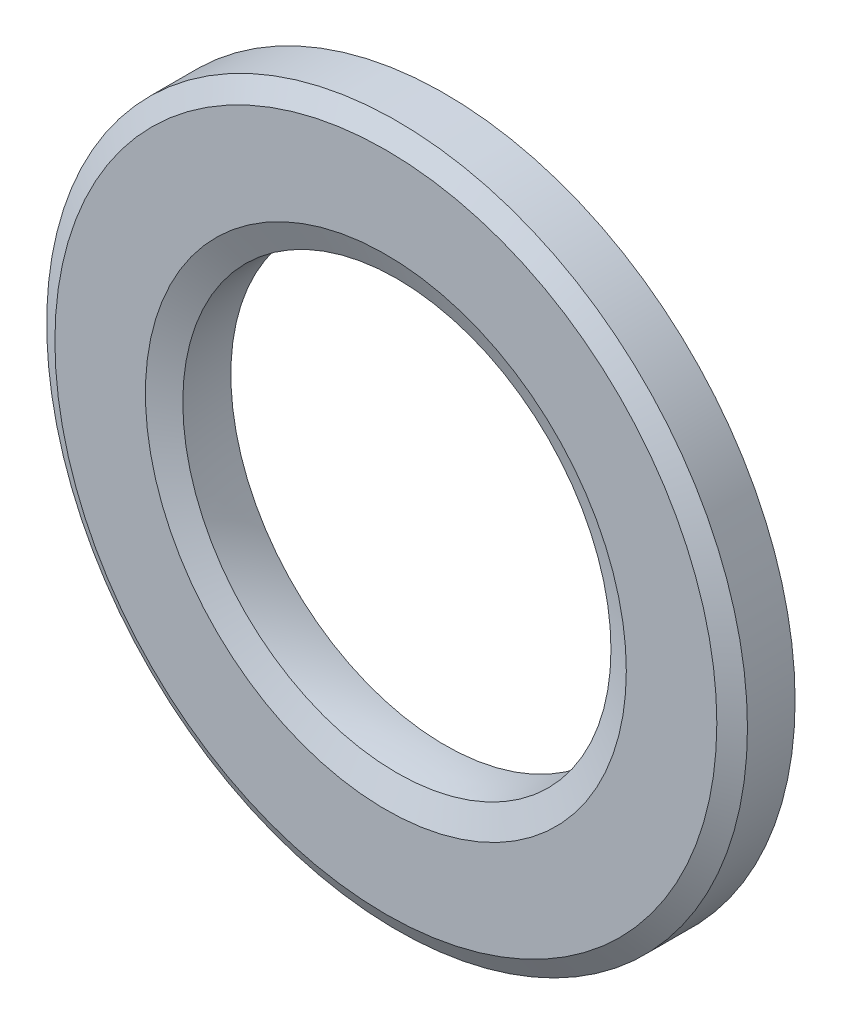
ISO-10303-21;
HEADER;
FILE_DESCRIPTION(('STEP AP214'),'2;1');
FILE_NAME('part.step','',(''),(''),'','','');
FILE_SCHEMA(('AUTOMOTIVE_DESIGN { 1 0 10303 214 1 1 1 1 }'));
ENDSEC;
DATA;
#1=APPLICATION_CONTEXT('core data for automotive mechanical design processes');
#2=APPLICATION_PROTOCOL_DEFINITION('international standard','automotive_design',2000,#1);
#3=PRODUCT_CONTEXT('',#1,'mechanical');
#4=PRODUCT('Part','Part','',(#3));
#5=PRODUCT_RELATED_PRODUCT_CATEGORY('part','',(#4));
#6=PRODUCT_DEFINITION_FORMATION('','',#4);
#7=PRODUCT_DEFINITION_CONTEXT('part definition',#1,'design');
#8=PRODUCT_DEFINITION('design','',#6,#7);
#9=PRODUCT_DEFINITION_SHAPE('','',#8);
#10=(LENGTH_UNIT() NAMED_UNIT(*) SI_UNIT(.MILLI.,.METRE.));
#11=(NAMED_UNIT(*) PLANE_ANGLE_UNIT() SI_UNIT($,.RADIAN.));
#12=(NAMED_UNIT(*) SI_UNIT($,.STERADIAN.) SOLID_ANGLE_UNIT());
#13=UNCERTAINTY_MEASURE_WITH_UNIT(LENGTH_MEASURE(1.E-05),#10,'distance_accuracy_value','');
#14=(GEOMETRIC_REPRESENTATION_CONTEXT(3) GLOBAL_UNCERTAINTY_ASSIGNED_CONTEXT((#13)) GLOBAL_UNIT_ASSIGNED_CONTEXT((#10,
#11,#12)) REPRESENTATION_CONTEXT('',''));
#15=CARTESIAN_POINT('',(0.,0.,0.));
#16=DIRECTION('',(0.,0.,1.));
#17=DIRECTION('',(1.,0.,0.));
#18=AXIS2_PLACEMENT_3D('',#15,#16,#17);
#19=CARTESIAN_POINT('',(0.,0.,0.793749999999997));
#20=DIRECTION('',(0.,0.,1.));
#21=DIRECTION('',(1.,0.,0.));
#22=AXIS2_PLACEMENT_3D('',#19,#20,#21);
#23=PLANE('',#22);
#24=CARTESIAN_POINT('',(0.,0.,0.793749999999997));
#25=DIRECTION('',(0.,0.,1.));
#26=DIRECTION('',(1.,0.,0.));
#27=AXIS2_PLACEMENT_3D('',#24,#25,#26);
#28=CIRCLE('',#27,5.44737872529574);
#29=CARTESIAN_POINT('',(5.44737872529574,0.,0.793749999999997));
#30=VERTEX_POINT('',#29);
#31=EDGE_CURVE('E10',#30,#30,#28,.F.);
#32=ORIENTED_EDGE('',*,*,#31,.T.);
#33=EDGE_LOOP('',(#32));
#34=FACE_BOUND('',#33,.T.);
#35=CARTESIAN_POINT('',(0.,0.,0.793749999999997));
#36=DIRECTION('',(0.,0.,1.));
#37=DIRECTION('',(1.,0.,0.));
#38=AXIS2_PLACEMENT_3D('',#35,#36,#37);
#39=CIRCLE('',#38,7.49755909487751);
#40=CARTESIAN_POINT('',(7.49755909487751,0.,0.793749999999997));
#41=VERTEX_POINT('',#40);
#42=EDGE_CURVE('E54',#41,#41,#39,.T.);
#43=ORIENTED_EDGE('',*,*,#42,.T.);
#44=EDGE_LOOP('',(#43));
#45=FACE_BOUND('',#44,.T.);
#46=ADVANCED_FACE('F34',(#34,#45),#23,.T.);
#47=CARTESIAN_POINT('',(0.,0.,0.793749999999997));
#48=DIRECTION('',(0.,0.,-1.));
#49=DIRECTION('',(-1.,0.,0.));
#50=AXIS2_PLACEMENT_3D('',#47,#48,#49);
#51=CYLINDRICAL_SURFACE('',#50,7.9375);
#52=CARTESIAN_POINT('',(0.,0.,-0.53975));
#53=DIRECTION('',(0.,0.,1.));
#54=DIRECTION('',(1.,0.,0.));
#55=AXIS2_PLACEMENT_3D('',#52,#53,#54);
#56=CIRCLE('',#55,7.9375);
#57=CARTESIAN_POINT('',(7.9375,0.,-0.53975));
#58=VERTEX_POINT('',#57);
#59=EDGE_CURVE('E60',#58,#58,#56,.T.);
#60=ORIENTED_EDGE('',*,*,#59,.T.);
#61=EDGE_LOOP('',(#60));
#62=FACE_BOUND('',#61,.T.);
#63=CARTESIAN_POINT('',(0.,0.,0.539749999999995));
#64=DIRECTION('',(0.,0.,1.));
#65=DIRECTION('',(1.,0.,0.));
#66=AXIS2_PLACEMENT_3D('',#63,#64,#65);
#67=CIRCLE('',#66,7.9375);
#68=CARTESIAN_POINT('',(7.9375,0.,0.539749999999995));
#69=VERTEX_POINT('',#68);
#70=EDGE_CURVE('E63',#69,#69,#67,.F.);
#71=ORIENTED_EDGE('',*,*,#70,.T.);
#72=EDGE_LOOP('',(#71));
#73=FACE_BOUND('',#72,.T.);
#74=ADVANCED_FACE('F67',(#62,#73),#51,.T.);
#75=CARTESIAN_POINT('',(0.,0.,-0.793750000000003));
#76=DIRECTION('',(0.,0.,1.));
#77=DIRECTION('',(1.,0.,0.));
#78=AXIS2_PLACEMENT_3D('',#75,#76,#77);
#79=PLANE('',#78);
#80=CARTESIAN_POINT('',(0.,0.,-0.793750000000003));
#81=DIRECTION('',(0.,0.,1.));
#82=DIRECTION('',(1.,0.,0.));
#83=AXIS2_PLACEMENT_3D('',#80,#81,#82);
#84=CIRCLE('',#83,5.44737872529574);
#85=CARTESIAN_POINT('',(5.44737872529574,0.,-0.793750000000003));
#86=VERTEX_POINT('',#85);
#87=EDGE_CURVE('E49',#86,#86,#84,.T.);
#88=ORIENTED_EDGE('',*,*,#87,.T.);
#89=EDGE_LOOP('',(#88));
#90=FACE_BOUND('',#89,.T.);
#91=CARTESIAN_POINT('',(0.,0.,-0.793750000000003));
#92=DIRECTION('',(0.,0.,1.));
#93=DIRECTION('',(1.,0.,0.));
#94=AXIS2_PLACEMENT_3D('',#91,#92,#93);
#95=CIRCLE('',#94,7.49755909487751);
#96=CARTESIAN_POINT('',(7.49755909487751,0.,-0.793750000000003));
#97=VERTEX_POINT('',#96);
#98=EDGE_CURVE('E57',#97,#97,#95,.F.);
#99=ORIENTED_EDGE('',*,*,#98,.T.);
#100=EDGE_LOOP('',(#99));
#101=FACE_BOUND('',#100,.T.);
#102=ADVANCED_FACE('F82',(#90,#101),#79,.F.);
#103=CARTESIAN_POINT('',(0.,0.,-0.53975));
#104=DIRECTION('',(0.,0.,1.));
#105=DIRECTION('',(1.,0.,0.));
#106=AXIS2_PLACEMENT_3D('',#103,#104,#105);
#107=CONICAL_SURFACE('',#106,7.9375,1.04719755119659);
#108=ORIENTED_EDGE('',*,*,#98,.F.);
#109=EDGE_LOOP('',(#108));
#110=FACE_BOUND('',#109,.T.);
#111=ORIENTED_EDGE('',*,*,#59,.F.);
#112=EDGE_LOOP('',(#111));
#113=FACE_BOUND('',#112,.T.);
#114=ADVANCED_FACE('F73',(#110,#113),#107,.T.);
#115=CARTESIAN_POINT('',(0.,0.,0.793749999999997));
#116=DIRECTION('',(0.,0.,-1.));
#117=DIRECTION('',(-1.,0.,0.));
#118=AXIS2_PLACEMENT_3D('',#115,#116,#117);
#119=CONICAL_SURFACE('',#118,7.49755909487751,1.04719755119659);
#120=ORIENTED_EDGE('',*,*,#70,.F.);
#121=EDGE_LOOP('',(#120));
#122=FACE_BOUND('',#121,.T.);
#123=ORIENTED_EDGE('',*,*,#42,.F.);
#124=EDGE_LOOP('',(#123));
#125=FACE_BOUND('',#124,.T.);
#126=ADVANCED_FACE('F69',(#122,#125),#119,.T.);
#127=CARTESIAN_POINT('',(0.,0.,0.));
#128=DIRECTION('',(0.,0.,1.));
#129=DIRECTION('',(0.,-1.,0.));
#130=AXIS2_PLACEMENT_3D('',#127,#128,#129);
#131=TOROIDAL_SURFACE('',#130,11.0525718749999,6.22657187499994);
#132=CARTESIAN_POINT('',(0.,0.,-0.544076658629484));
#133=DIRECTION('',(0.,0.,1.));
#134=DIRECTION('',(1.,0.,0.));
#135=AXIS2_PLACEMENT_3D('',#132,#133,#134);
#136=CIRCLE('',#135,4.84981620480989);
#137=CARTESIAN_POINT('',(4.84981620480989,0.,-0.544076658629484));
#138=VERTEX_POINT('',#137);
#139=EDGE_CURVE('E41',#138,#138,#136,.F.);
#140=ORIENTED_EDGE('',*,*,#139,.T.);
#141=EDGE_LOOP('',(#140));
#142=FACE_BOUND('',#141,.T.);
#143=CARTESIAN_POINT('',(0.,0.,0.544076658629479));
#144=DIRECTION('',(0.,0.,-1.));
#145=DIRECTION('',(-1.,0.,0.));
#146=AXIS2_PLACEMENT_3D('',#143,#144,#145);
#147=CIRCLE('',#146,4.84981620480989);
#148=CARTESIAN_POINT('',(-4.84981620480989,0.,0.544076658629479));
#149=VERTEX_POINT('',#148);
#150=EDGE_CURVE('E45',#149,#149,#147,.F.);
#151=ORIENTED_EDGE('',*,*,#150,.T.);
#152=EDGE_LOOP('',(#151));
#153=FACE_BOUND('',#152,.T.);
#154=ADVANCED_FACE('F72',(#142,#153),#131,.T.);
#155=CARTESIAN_POINT('',(0.,0.,-0.793750000000003));
#156=DIRECTION('',(0.,0.,-1.));
#157=DIRECTION('',(-1.,0.,0.));
#158=AXIS2_PLACEMENT_3D('',#155,#156,#157);
#159=CONICAL_SURFACE('',#158,5.44737872529574,1.17502321677407);
#160=ORIENTED_EDGE('',*,*,#139,.F.);
#161=EDGE_LOOP('',(#160));
#162=FACE_BOUND('',#161,.T.);
#163=ORIENTED_EDGE('',*,*,#87,.F.);
#164=EDGE_LOOP('',(#163));
#165=FACE_BOUND('',#164,.T.);
#166=ADVANCED_FACE('F90',(#162,#165),#159,.F.);
#167=CARTESIAN_POINT('',(0.,0.,0.544076658629479));
#168=DIRECTION('',(0.,0.,1.));
#169=DIRECTION('',(1.,0.,0.));
#170=AXIS2_PLACEMENT_3D('',#167,#168,#169);
#171=CONICAL_SURFACE('',#170,4.84981620480989,1.17502321677407);
#172=ORIENTED_EDGE('',*,*,#31,.F.);
#173=EDGE_LOOP('',(#172));
#174=FACE_BOUND('',#173,.T.);
#175=ORIENTED_EDGE('',*,*,#150,.F.);
#176=EDGE_LOOP('',(#175));
#177=FACE_BOUND('',#176,.T.);
#178=ADVANCED_FACE('F36',(#174,#177),#171,.F.);
#179=CLOSED_SHELL('',(#46,#74,#102,#114,#126,#154,#166,#178));
#180=MANIFOLD_SOLID_BREP('B2',#179);
#181=ADVANCED_BREP_SHAPE_REPRESENTATION('',(#18,#180),#14);
#182=SHAPE_DEFINITION_REPRESENTATION(#9,#181);
ENDSEC;
END-ISO-10303-21;
